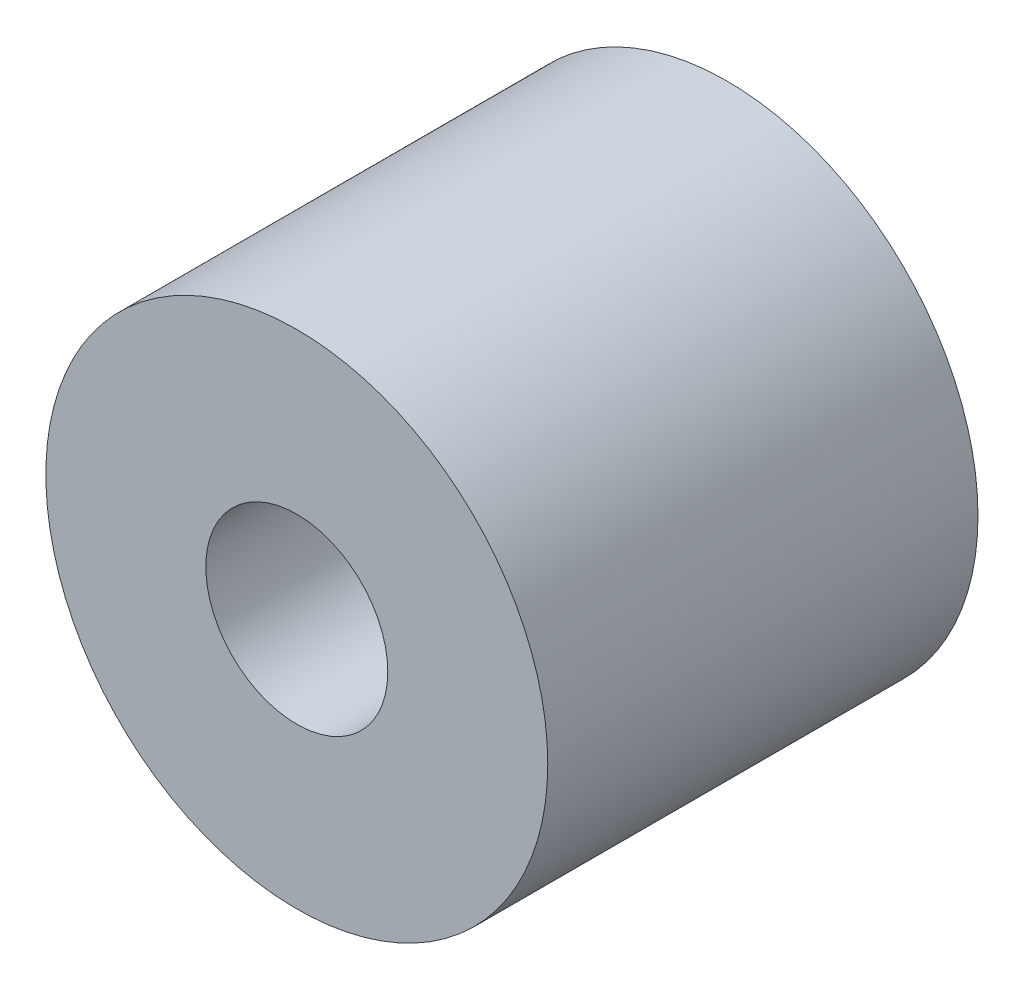
ISO-10303-21;
HEADER;
FILE_DESCRIPTION(('STEP AP214'),'2;1');
FILE_NAME('part.step','',(''),(''),'','','');
FILE_SCHEMA(('AUTOMOTIVE_DESIGN { 1 0 10303 214 1 1 1 1 }'));
ENDSEC;
DATA;
#1=APPLICATION_CONTEXT('core data for automotive mechanical design processes');
#2=APPLICATION_PROTOCOL_DEFINITION('international standard','automotive_design',2000,#1);
#3=PRODUCT_CONTEXT('',#1,'mechanical');
#4=PRODUCT('Part','Part','',(#3));
#5=PRODUCT_RELATED_PRODUCT_CATEGORY('part','',(#4));
#6=PRODUCT_DEFINITION_FORMATION('','',#4);
#7=PRODUCT_DEFINITION_CONTEXT('part definition',#1,'design');
#8=PRODUCT_DEFINITION('design','',#6,#7);
#9=PRODUCT_DEFINITION_SHAPE('','',#8);
#10=(LENGTH_UNIT() NAMED_UNIT(*) SI_UNIT(.MILLI.,.METRE.));
#11=(NAMED_UNIT(*) PLANE_ANGLE_UNIT() SI_UNIT($,.RADIAN.));
#12=(NAMED_UNIT(*) SI_UNIT($,.STERADIAN.) SOLID_ANGLE_UNIT());
#13=UNCERTAINTY_MEASURE_WITH_UNIT(LENGTH_MEASURE(1.E-05),#10,'distance_accuracy_value','');
#14=(GEOMETRIC_REPRESENTATION_CONTEXT(3) GLOBAL_UNCERTAINTY_ASSIGNED_CONTEXT((#13)) GLOBAL_UNIT_ASSIGNED_CONTEXT((#10,
#11,#12)) REPRESENTATION_CONTEXT('',''));
#15=CARTESIAN_POINT('',(0.,0.,0.));
#16=DIRECTION('',(0.,0.,1.));
#17=DIRECTION('',(1.,0.,0.));
#18=AXIS2_PLACEMENT_3D('',#15,#16,#17);
#19=CARTESIAN_POINT('',(0.,0.,30.));
#20=DIRECTION('',(0.,0.,1.));
#21=DIRECTION('',(1.,0.,0.));
#22=AXIS2_PLACEMENT_3D('',#19,#20,#21);
#23=PLANE('',#22);
#24=CARTESIAN_POINT('',(0.,0.,30.));
#25=DIRECTION('',(0.,0.,1.));
#26=DIRECTION('',(1.,0.,0.));
#27=AXIS2_PLACEMENT_3D('',#24,#25,#26);
#28=CIRCLE('',#27,17.5);
#29=CARTESIAN_POINT('',(17.5,0.,30.));
#30=VERTEX_POINT('',#29);
#31=EDGE_CURVE('E10',#30,#30,#28,.T.);
#32=ORIENTED_EDGE('',*,*,#31,.T.);
#33=EDGE_LOOP('',(#32));
#34=FACE_BOUND('',#33,.T.);
#35=CARTESIAN_POINT('',(0.,0.,30.));
#36=DIRECTION('',(0.,0.,1.));
#37=DIRECTION('',(1.,0.,0.));
#38=AXIS2_PLACEMENT_3D('',#35,#36,#37);
#39=CIRCLE('',#38,6.345);
#40=CARTESIAN_POINT('',(6.345,0.,30.));
#41=VERTEX_POINT('',#40);
#42=EDGE_CURVE('E42',#41,#41,#39,.T.);
#43=ORIENTED_EDGE('',*,*,#42,.F.);
#44=EDGE_LOOP('',(#43));
#45=FACE_BOUND('',#44,.T.);
#46=ADVANCED_FACE('F31',(#34,#45),#23,.T.);
#47=CARTESIAN_POINT('',(0.,0.,0.));
#48=DIRECTION('',(0.,0.,1.));
#49=DIRECTION('',(1.,0.,0.));
#50=AXIS2_PLACEMENT_3D('',#47,#48,#49);
#51=PLANE('',#50);
#52=CARTESIAN_POINT('',(0.,0.,0.));
#53=DIRECTION('',(0.,0.,1.));
#54=DIRECTION('',(1.,0.,0.));
#55=AXIS2_PLACEMENT_3D('',#52,#53,#54);
#56=CIRCLE('',#55,17.5);
#57=CARTESIAN_POINT('',(17.5,0.,0.));
#58=VERTEX_POINT('',#57);
#59=EDGE_CURVE('E35',#58,#58,#56,.T.);
#60=ORIENTED_EDGE('',*,*,#59,.F.);
#61=EDGE_LOOP('',(#60));
#62=FACE_BOUND('',#61,.T.);
#63=CARTESIAN_POINT('',(0.,0.,0.));
#64=DIRECTION('',(0.,0.,1.));
#65=DIRECTION('',(1.,0.,0.));
#66=AXIS2_PLACEMENT_3D('',#63,#64,#65);
#67=CIRCLE('',#66,6.345);
#68=CARTESIAN_POINT('',(6.345,0.,0.));
#69=VERTEX_POINT('',#68);
#70=EDGE_CURVE('E44',#69,#69,#67,.T.);
#71=ORIENTED_EDGE('',*,*,#70,.T.);
#72=EDGE_LOOP('',(#71));
#73=FACE_BOUND('',#72,.T.);
#74=ADVANCED_FACE('F54',(#62,#73),#51,.F.);
#75=CARTESIAN_POINT('',(0.,0.,30.));
#76=DIRECTION('',(0.,0.,-1.));
#77=DIRECTION('',(-1.,0.,0.));
#78=AXIS2_PLACEMENT_3D('',#75,#76,#77);
#79=CYLINDRICAL_SURFACE('',#78,17.5);
#80=ORIENTED_EDGE('',*,*,#31,.F.);
#81=EDGE_LOOP('',(#80));
#82=FACE_BOUND('',#81,.T.);
#83=ORIENTED_EDGE('',*,*,#59,.T.);
#84=EDGE_LOOP('',(#83));
#85=FACE_BOUND('',#84,.T.);
#86=ADVANCED_FACE('F33',(#82,#85),#79,.T.);
#87=CARTESIAN_POINT('',(0.,0.,30.));
#88=DIRECTION('',(0.,0.,-1.));
#89=DIRECTION('',(-1.,0.,0.));
#90=AXIS2_PLACEMENT_3D('',#87,#88,#89);
#91=CYLINDRICAL_SURFACE('',#90,6.345);
#92=ORIENTED_EDGE('',*,*,#42,.T.);
#93=EDGE_LOOP('',(#92));
#94=FACE_BOUND('',#93,.T.);
#95=ORIENTED_EDGE('',*,*,#70,.F.);
#96=EDGE_LOOP('',(#95));
#97=FACE_BOUND('',#96,.T.);
#98=ADVANCED_FACE('F50',(#94,#97),#91,.F.);
#99=CLOSED_SHELL('',(#46,#74,#86,#98));
#100=MANIFOLD_SOLID_BREP('B2',#99);
#101=ADVANCED_BREP_SHAPE_REPRESENTATION('',(#18,#100),#14);
#102=SHAPE_DEFINITION_REPRESENTATION(#9,#101);
ENDSEC;
END-ISO-10303-21;
